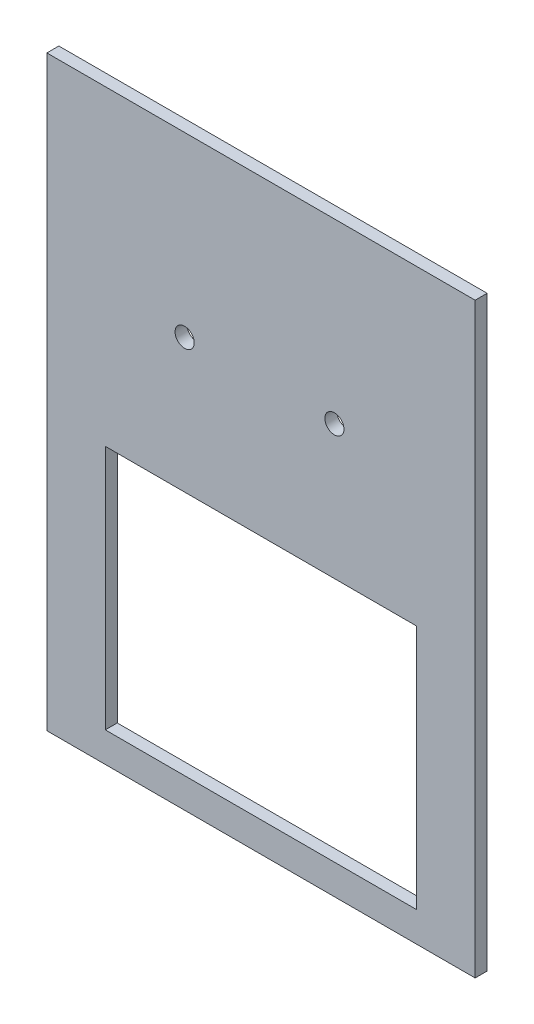
ISO-10303-21;
HEADER;
FILE_DESCRIPTION(('STEP AP214'),'2;1');
FILE_NAME('part.step','',(''),(''),'','','');
FILE_SCHEMA(('AUTOMOTIVE_DESIGN { 1 0 10303 214 1 1 1 1 }'));
ENDSEC;
DATA;
#1=APPLICATION_CONTEXT('core data for automotive mechanical design processes');
#2=APPLICATION_PROTOCOL_DEFINITION('international standard','automotive_design',2000,#1);
#3=PRODUCT_CONTEXT('',#1,'mechanical');
#4=PRODUCT('Part','Part','',(#3));
#5=PRODUCT_RELATED_PRODUCT_CATEGORY('part','',(#4));
#6=PRODUCT_DEFINITION_FORMATION('','',#4);
#7=PRODUCT_DEFINITION_CONTEXT('part definition',#1,'design');
#8=PRODUCT_DEFINITION('design','',#6,#7);
#9=PRODUCT_DEFINITION_SHAPE('','',#8);
#10=(LENGTH_UNIT() NAMED_UNIT(*) SI_UNIT(.MILLI.,.METRE.));
#11=(NAMED_UNIT(*) PLANE_ANGLE_UNIT() SI_UNIT($,.RADIAN.));
#12=(NAMED_UNIT(*) SI_UNIT($,.STERADIAN.) SOLID_ANGLE_UNIT());
#13=UNCERTAINTY_MEASURE_WITH_UNIT(LENGTH_MEASURE(1.E-05),#10,'distance_accuracy_value','');
#14=(GEOMETRIC_REPRESENTATION_CONTEXT(3) GLOBAL_UNCERTAINTY_ASSIGNED_CONTEXT((#13)) GLOBAL_UNIT_ASSIGNED_CONTEXT((#10,
#11,#12)) REPRESENTATION_CONTEXT('',''));
#15=CARTESIAN_POINT('',(0.,0.,0.));
#16=DIRECTION('',(0.,0.,1.));
#17=DIRECTION('',(1.,0.,0.));
#18=AXIS2_PLACEMENT_3D('',#15,#16,#17);
#19=CARTESIAN_POINT('',(0.,0.,2.));
#20=DIRECTION('',(0.,0.,1.));
#21=DIRECTION('',(1.,0.,0.));
#22=AXIS2_PLACEMENT_3D('',#19,#20,#21);
#23=PLANE('',#22);
#24=DIRECTION('',(-1.,0.,0.));
#25=VECTOR('',#24,1.);
#26=CARTESIAN_POINT('',(-26.,-1.5,2.));
#27=LINE('',#26,#25);
#28=CARTESIAN_POINT('',(26.,-1.5,2.));
#29=VERTEX_POINT('',#28);
#30=CARTESIAN_POINT('',(-26.,-1.5,2.));
#31=VERTEX_POINT('',#30);
#32=EDGE_CURVE('E126',#29,#31,#27,.T.);
#33=ORIENTED_EDGE('',*,*,#32,.F.);
#34=DIRECTION('',(0.,1.,0.));
#35=VECTOR('',#34,1.);
#36=CARTESIAN_POINT('',(26.,-1.5,2.));
#37=LINE('',#36,#35);
#38=CARTESIAN_POINT('',(26.,-42.5,2.));
#39=VERTEX_POINT('',#38);
#40=EDGE_CURVE('E117',#39,#29,#37,.T.);
#41=ORIENTED_EDGE('',*,*,#40,.F.);
#42=DIRECTION('',(1.,0.,0.));
#43=VECTOR('',#42,1.);
#44=CARTESIAN_POINT('',(-26.,-42.5,2.));
#45=LINE('',#44,#43);
#46=CARTESIAN_POINT('',(-26.,-42.5,2.));
#47=VERTEX_POINT('',#46);
#48=EDGE_CURVE('E146',#47,#39,#45,.T.);
#49=ORIENTED_EDGE('',*,*,#48,.F.);
#50=DIRECTION('',(0.,-1.,0.));
#51=VECTOR('',#50,1.);
#52=CARTESIAN_POINT('',(-26.,-1.5,2.));
#53=LINE('',#52,#51);
#54=EDGE_CURVE('E140',#31,#47,#53,.T.);
#55=ORIENTED_EDGE('',*,*,#54,.F.);
#56=EDGE_LOOP('',(#33,#41,#49,#55));
#57=FACE_BOUND('',#56,.T.);
#58=DIRECTION('',(0.,1.,0.));
#59=VECTOR('',#58,1.);
#60=CARTESIAN_POINT('',(35.75,47.5,2.));
#61=LINE('',#60,#59);
#62=CARTESIAN_POINT('',(35.75,-47.5,2.));
#63=VERTEX_POINT('',#62);
#64=CARTESIAN_POINT('',(35.75,50.5,2.));
#65=VERTEX_POINT('',#64);
#66=EDGE_CURVE('E169',#63,#65,#61,.T.);
#67=ORIENTED_EDGE('',*,*,#66,.T.);
#68=DIRECTION('',(-1.,0.,0.));
#69=VECTOR('',#68,1.);
#70=CARTESIAN_POINT('',(35.75,50.5,2.));
#71=LINE('',#70,#69);
#72=CARTESIAN_POINT('',(-35.75,50.5,2.));
#73=VERTEX_POINT('',#72);
#74=EDGE_CURVE('E172',#65,#73,#71,.T.);
#75=ORIENTED_EDGE('',*,*,#74,.T.);
#76=DIRECTION('',(0.,-1.,0.));
#77=VECTOR('',#76,1.);
#78=CARTESIAN_POINT('',(-35.75,50.5,2.));
#79=LINE('',#78,#77);
#80=CARTESIAN_POINT('',(-35.75,-47.5,2.));
#81=VERTEX_POINT('',#80);
#82=EDGE_CURVE('E176',#73,#81,#79,.T.);
#83=ORIENTED_EDGE('',*,*,#82,.T.);
#84=DIRECTION('',(1.,0.,0.));
#85=VECTOR('',#84,1.);
#86=CARTESIAN_POINT('',(-35.75,-47.5,2.));
#87=LINE('',#86,#85);
#88=EDGE_CURVE('E179',#81,#63,#87,.T.);
#89=ORIENTED_EDGE('',*,*,#88,.T.);
#90=EDGE_LOOP('',(#67,#75,#83,#89));
#91=FACE_BOUND('',#90,.T.);
#92=CARTESIAN_POINT('',(12.2522780221197,20.8794174428847,2.));
#93=DIRECTION('',(0.,0.,1.));
#94=DIRECTION('',(1.,0.,0.));
#95=AXIS2_PLACEMENT_3D('',#92,#93,#94);
#96=CIRCLE('',#95,1.59999999999999);
#97=CARTESIAN_POINT('',(13.8522780221197,20.8794174428847,2.));
#98=VERTEX_POINT('',#97);
#99=EDGE_CURVE('E153',#98,#98,#96,.F.);
#100=ORIENTED_EDGE('',*,*,#99,.T.);
#101=EDGE_LOOP('',(#100));
#102=FACE_BOUND('',#101,.T.);
#103=CARTESIAN_POINT('',(-12.7477219778803,20.8794174428847,2.));
#104=DIRECTION('',(0.,0.,1.));
#105=DIRECTION('',(1.,0.,0.));
#106=AXIS2_PLACEMENT_3D('',#103,#104,#105);
#107=CIRCLE('',#106,1.59999999999999);
#108=CARTESIAN_POINT('',(-11.1477219778803,20.8794174428847,2.));
#109=VERTEX_POINT('',#108);
#110=EDGE_CURVE('E230',#109,#109,#107,.F.);
#111=ORIENTED_EDGE('',*,*,#110,.T.);
#112=EDGE_LOOP('',(#111));
#113=FACE_BOUND('',#112,.T.);
#114=ADVANCED_FACE('F51',(#57,#91,#102,#113),#23,.T.);
#115=CARTESIAN_POINT('',(0.,0.,0.));
#116=DIRECTION('',(0.,0.,1.));
#117=DIRECTION('',(1.,0.,0.));
#118=AXIS2_PLACEMENT_3D('',#115,#116,#117);
#119=PLANE('',#118);
#120=CARTESIAN_POINT('',(-12.7477219778803,20.8794174428847,0.));
#121=DIRECTION('',(0.,0.,-1.));
#122=DIRECTION('',(-1.,0.,0.));
#123=AXIS2_PLACEMENT_3D('',#120,#121,#122);
#124=CIRCLE('',#123,1.59999999999999);
#125=CARTESIAN_POINT('',(-14.3477219778803,20.8794174428847,0.));
#126=VERTEX_POINT('',#125);
#127=EDGE_CURVE('E233',#126,#126,#124,.T.);
#128=ORIENTED_EDGE('',*,*,#127,.F.);
#129=EDGE_LOOP('',(#128));
#130=FACE_BOUND('',#129,.T.);
#131=CARTESIAN_POINT('',(12.2522780221197,20.8794174428847,0.));
#132=DIRECTION('',(0.,0.,-1.));
#133=DIRECTION('',(-1.,0.,0.));
#134=AXIS2_PLACEMENT_3D('',#131,#132,#133);
#135=CIRCLE('',#134,1.59999999999999);
#136=CARTESIAN_POINT('',(10.6522780221197,20.8794174428847,0.));
#137=VERTEX_POINT('',#136);
#138=EDGE_CURVE('E232',#137,#137,#135,.T.);
#139=ORIENTED_EDGE('',*,*,#138,.F.);
#140=EDGE_LOOP('',(#139));
#141=FACE_BOUND('',#140,.T.);
#142=DIRECTION('',(0.,1.,0.));
#143=VECTOR('',#142,1.);
#144=CARTESIAN_POINT('',(35.75,47.5,0.));
#145=LINE('',#144,#143);
#146=CARTESIAN_POINT('',(35.75,-47.5,0.));
#147=VERTEX_POINT('',#146);
#148=CARTESIAN_POINT('',(35.75,50.5,0.));
#149=VERTEX_POINT('',#148);
#150=EDGE_CURVE('E135',#147,#149,#145,.T.);
#151=ORIENTED_EDGE('',*,*,#150,.F.);
#152=DIRECTION('',(1.,0.,0.));
#153=VECTOR('',#152,1.);
#154=CARTESIAN_POINT('',(-35.75,-47.5,0.));
#155=LINE('',#154,#153);
#156=CARTESIAN_POINT('',(-35.75,-47.5,0.));
#157=VERTEX_POINT('',#156);
#158=EDGE_CURVE('E173',#157,#147,#155,.T.);
#159=ORIENTED_EDGE('',*,*,#158,.F.);
#160=DIRECTION('',(0.,-1.,0.));
#161=VECTOR('',#160,1.);
#162=CARTESIAN_POINT('',(-35.75,47.5,0.));
#163=LINE('',#162,#161);
#164=CARTESIAN_POINT('',(-35.75,50.5,0.));
#165=VERTEX_POINT('',#164);
#166=EDGE_CURVE('E189',#165,#157,#163,.T.);
#167=ORIENTED_EDGE('',*,*,#166,.F.);
#168=DIRECTION('',(-1.,0.,0.));
#169=VECTOR('',#168,1.);
#170=CARTESIAN_POINT('',(35.75,50.5,0.));
#171=LINE('',#170,#169);
#172=EDGE_CURVE('E185',#149,#165,#171,.T.);
#173=ORIENTED_EDGE('',*,*,#172,.F.);
#174=EDGE_LOOP('',(#151,#159,#167,#173));
#175=FACE_BOUND('',#174,.T.);
#176=DIRECTION('',(0.,1.,0.));
#177=VECTOR('',#176,1.);
#178=CARTESIAN_POINT('',(26.,-1.5,0.));
#179=LINE('',#178,#177);
#180=CARTESIAN_POINT('',(26.,-42.5,0.));
#181=VERTEX_POINT('',#180);
#182=CARTESIAN_POINT('',(26.,-1.5,0.));
#183=VERTEX_POINT('',#182);
#184=EDGE_CURVE('E75',#181,#183,#179,.T.);
#185=ORIENTED_EDGE('',*,*,#184,.T.);
#186=DIRECTION('',(-1.,0.,0.));
#187=VECTOR('',#186,1.);
#188=CARTESIAN_POINT('',(-26.,-1.5,0.));
#189=LINE('',#188,#187);
#190=CARTESIAN_POINT('',(-26.,-1.5,0.));
#191=VERTEX_POINT('',#190);
#192=EDGE_CURVE('E133',#183,#191,#189,.T.);
#193=ORIENTED_EDGE('',*,*,#192,.T.);
#194=DIRECTION('',(0.,-1.,0.));
#195=VECTOR('',#194,1.);
#196=CARTESIAN_POINT('',(-26.,-1.5,0.));
#197=LINE('',#196,#195);
#198=CARTESIAN_POINT('',(-26.,-42.5,0.));
#199=VERTEX_POINT('',#198);
#200=EDGE_CURVE('E156',#191,#199,#197,.T.);
#201=ORIENTED_EDGE('',*,*,#200,.T.);
#202=DIRECTION('',(1.,0.,0.));
#203=VECTOR('',#202,1.);
#204=CARTESIAN_POINT('',(-26.,-42.5,0.));
#205=LINE('',#204,#203);
#206=EDGE_CURVE('E127',#199,#181,#205,.T.);
#207=ORIENTED_EDGE('',*,*,#206,.T.);
#208=EDGE_LOOP('',(#185,#193,#201,#207));
#209=FACE_BOUND('',#208,.T.);
#210=ADVANCED_FACE('F213',(#130,#141,#175,#209),#119,.F.);
#211=CARTESIAN_POINT('',(35.75,47.5,2.));
#212=DIRECTION('',(-1.,0.,0.));
#213=DIRECTION('',(0.,0.,1.));
#214=AXIS2_PLACEMENT_3D('',#211,#212,#213);
#215=PLANE('',#214);
#216=ORIENTED_EDGE('',*,*,#150,.T.);
#217=DIRECTION('',(0.,0.,-1.));
#218=VECTOR('',#217,1.);
#219=CARTESIAN_POINT('',(35.75,50.5,2.));
#220=LINE('',#219,#218);
#221=EDGE_CURVE('E11',#65,#149,#220,.T.);
#222=ORIENTED_EDGE('',*,*,#221,.F.);
#223=ORIENTED_EDGE('',*,*,#66,.F.);
#224=DIRECTION('',(0.,0.,-1.));
#225=VECTOR('',#224,1.);
#226=CARTESIAN_POINT('',(35.75,-47.5,2.));
#227=LINE('',#226,#225);
#228=EDGE_CURVE('E182',#63,#147,#227,.T.);
#229=ORIENTED_EDGE('',*,*,#228,.T.);
#230=EDGE_LOOP('',(#216,#222,#223,#229));
#231=FACE_BOUND('',#230,.T.);
#232=ADVANCED_FACE('F53',(#231),#215,.F.);
#233=CARTESIAN_POINT('',(35.75,50.5,2.));
#234=DIRECTION('',(0.,-1.,0.));
#235=DIRECTION('',(1.,0.,0.));
#236=AXIS2_PLACEMENT_3D('',#233,#234,#235);
#237=PLANE('',#236);
#238=ORIENTED_EDGE('',*,*,#172,.T.);
#239=DIRECTION('',(0.,0.,-1.));
#240=VECTOR('',#239,1.);
#241=CARTESIAN_POINT('',(-35.75,50.5,2.));
#242=LINE('',#241,#240);
#243=EDGE_CURVE('E60',#73,#165,#242,.T.);
#244=ORIENTED_EDGE('',*,*,#243,.F.);
#245=ORIENTED_EDGE('',*,*,#74,.F.);
#246=ORIENTED_EDGE('',*,*,#221,.T.);
#247=EDGE_LOOP('',(#238,#244,#245,#246));
#248=FACE_BOUND('',#247,.T.);
#249=ADVANCED_FACE('F209',(#248),#237,.F.);
#250=CARTESIAN_POINT('',(-35.75,47.5,2.));
#251=DIRECTION('',(1.,0.,0.));
#252=DIRECTION('',(0.,1.,0.));
#253=AXIS2_PLACEMENT_3D('',#250,#251,#252);
#254=PLANE('',#253);
#255=ORIENTED_EDGE('',*,*,#166,.T.);
#256=DIRECTION('',(0.,0.,-1.));
#257=VECTOR('',#256,1.);
#258=CARTESIAN_POINT('',(-35.75,-47.5,2.));
#259=LINE('',#258,#257);
#260=EDGE_CURVE('E198',#81,#157,#259,.T.);
#261=ORIENTED_EDGE('',*,*,#260,.F.);
#262=ORIENTED_EDGE('',*,*,#82,.F.);
#263=ORIENTED_EDGE('',*,*,#243,.T.);
#264=EDGE_LOOP('',(#255,#261,#262,#263));
#265=FACE_BOUND('',#264,.T.);
#266=ADVANCED_FACE('F205',(#265),#254,.F.);
#267=CARTESIAN_POINT('',(-35.75,-47.5,2.));
#268=DIRECTION('',(0.,1.,0.));
#269=DIRECTION('',(0.,0.,1.));
#270=AXIS2_PLACEMENT_3D('',#267,#268,#269);
#271=PLANE('',#270);
#272=ORIENTED_EDGE('',*,*,#158,.T.);
#273=ORIENTED_EDGE('',*,*,#228,.F.);
#274=ORIENTED_EDGE('',*,*,#88,.F.);
#275=ORIENTED_EDGE('',*,*,#260,.T.);
#276=EDGE_LOOP('',(#272,#273,#274,#275));
#277=FACE_BOUND('',#276,.T.);
#278=ADVANCED_FACE('F218',(#277),#271,.F.);
#279=CARTESIAN_POINT('',(26.,-1.5,2.));
#280=DIRECTION('',(-1.,0.,0.));
#281=DIRECTION('',(0.,-1.,0.));
#282=AXIS2_PLACEMENT_3D('',#279,#280,#281);
#283=PLANE('',#282);
#284=ORIENTED_EDGE('',*,*,#184,.F.);
#285=DIRECTION('',(0.,0.,-1.));
#286=VECTOR('',#285,1.);
#287=CARTESIAN_POINT('',(26.,-42.5,2.));
#288=LINE('',#287,#286);
#289=EDGE_CURVE('E121',#39,#181,#288,.T.);
#290=ORIENTED_EDGE('',*,*,#289,.F.);
#291=ORIENTED_EDGE('',*,*,#40,.T.);
#292=DIRECTION('',(0.,0.,-1.));
#293=VECTOR('',#292,1.);
#294=CARTESIAN_POINT('',(26.,-1.5,2.));
#295=LINE('',#294,#293);
#296=EDGE_CURVE('E120',#29,#183,#295,.T.);
#297=ORIENTED_EDGE('',*,*,#296,.T.);
#298=EDGE_LOOP('',(#284,#290,#291,#297));
#299=FACE_BOUND('',#298,.T.);
#300=ADVANCED_FACE('F119',(#299),#283,.T.);
#301=CARTESIAN_POINT('',(-26.,-1.5,2.));
#302=DIRECTION('',(0.,-1.,0.));
#303=DIRECTION('',(0.,0.,-1.));
#304=AXIS2_PLACEMENT_3D('',#301,#302,#303);
#305=PLANE('',#304);
#306=ORIENTED_EDGE('',*,*,#192,.F.);
#307=ORIENTED_EDGE('',*,*,#296,.F.);
#308=ORIENTED_EDGE('',*,*,#32,.T.);
#309=DIRECTION('',(0.,0.,-1.));
#310=VECTOR('',#309,1.);
#311=CARTESIAN_POINT('',(-26.,-1.5,2.));
#312=LINE('',#311,#310);
#313=EDGE_CURVE('E136',#31,#191,#312,.T.);
#314=ORIENTED_EDGE('',*,*,#313,.T.);
#315=EDGE_LOOP('',(#306,#307,#308,#314));
#316=FACE_BOUND('',#315,.T.);
#317=ADVANCED_FACE('F130',(#316),#305,.T.);
#318=CARTESIAN_POINT('',(-26.,-1.5,2.));
#319=DIRECTION('',(1.,0.,0.));
#320=DIRECTION('',(0.,1.,0.));
#321=AXIS2_PLACEMENT_3D('',#318,#319,#320);
#322=PLANE('',#321);
#323=ORIENTED_EDGE('',*,*,#200,.F.);
#324=ORIENTED_EDGE('',*,*,#313,.F.);
#325=ORIENTED_EDGE('',*,*,#54,.T.);
#326=DIRECTION('',(0.,0.,-1.));
#327=VECTOR('',#326,1.);
#328=CARTESIAN_POINT('',(-26.,-42.5,2.));
#329=LINE('',#328,#327);
#330=EDGE_CURVE('E67',#47,#199,#329,.T.);
#331=ORIENTED_EDGE('',*,*,#330,.T.);
#332=EDGE_LOOP('',(#323,#324,#325,#331));
#333=FACE_BOUND('',#332,.T.);
#334=ADVANCED_FACE('F258',(#333),#322,.T.);
#335=CARTESIAN_POINT('',(-26.,-42.5,2.));
#336=DIRECTION('',(0.,1.,0.));
#337=DIRECTION('',(0.,0.,1.));
#338=AXIS2_PLACEMENT_3D('',#335,#336,#337);
#339=PLANE('',#338);
#340=ORIENTED_EDGE('',*,*,#206,.F.);
#341=ORIENTED_EDGE('',*,*,#330,.F.);
#342=ORIENTED_EDGE('',*,*,#48,.T.);
#343=ORIENTED_EDGE('',*,*,#289,.T.);
#344=EDGE_LOOP('',(#340,#341,#342,#343));
#345=FACE_BOUND('',#344,.T.);
#346=ADVANCED_FACE('F250',(#345),#339,.T.);
#347=CARTESIAN_POINT('',(12.2522780221197,20.8794174428847,0.));
#348=DIRECTION('',(0.,0.,-1.));
#349=DIRECTION('',(-1.,0.,0.));
#350=AXIS2_PLACEMENT_3D('',#347,#348,#349);
#351=CYLINDRICAL_SURFACE('',#350,1.59999999999999);
#352=ORIENTED_EDGE('',*,*,#99,.F.);
#353=EDGE_LOOP('',(#352));
#354=FACE_BOUND('',#353,.T.);
#355=ORIENTED_EDGE('',*,*,#138,.T.);
#356=EDGE_LOOP('',(#355));
#357=FACE_BOUND('',#356,.T.);
#358=ADVANCED_FACE('F248',(#354,#357),#351,.F.);
#359=CARTESIAN_POINT('',(-12.7477219778803,20.8794174428847,0.));
#360=DIRECTION('',(0.,0.,-1.));
#361=DIRECTION('',(-1.,0.,0.));
#362=AXIS2_PLACEMENT_3D('',#359,#360,#361);
#363=CYLINDRICAL_SURFACE('',#362,1.59999999999999);
#364=ORIENTED_EDGE('',*,*,#110,.F.);
#365=EDGE_LOOP('',(#364));
#366=FACE_BOUND('',#365,.T.);
#367=ORIENTED_EDGE('',*,*,#127,.T.);
#368=EDGE_LOOP('',(#367));
#369=FACE_BOUND('',#368,.T.);
#370=ADVANCED_FACE('F241',(#366,#369),#363,.F.);
#371=CLOSED_SHELL('',(#114,#210,#232,#249,#266,#278,#300,#317,#334,#346,#358,#370));
#372=MANIFOLD_SOLID_BREP('B2',#371);
#373=ADVANCED_BREP_SHAPE_REPRESENTATION('',(#18,#372),#14);
#374=SHAPE_DEFINITION_REPRESENTATION(#9,#373);
ENDSEC;
END-ISO-10303-21;
